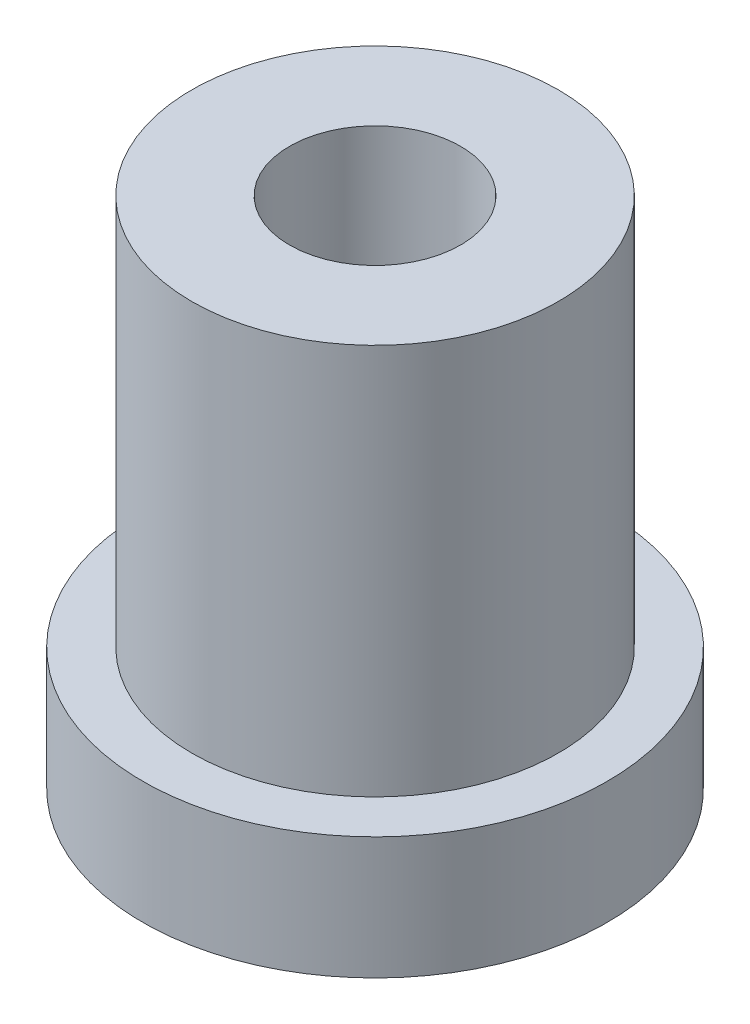
ISO-10303-21;
HEADER;
FILE_DESCRIPTION(('STEP AP214'),'2;1');
FILE_NAME('part.step','',(''),(''),'','','');
FILE_SCHEMA(('AUTOMOTIVE_DESIGN { 1 0 10303 214 1 1 1 1 }'));
ENDSEC;
DATA;
#1=APPLICATION_CONTEXT('core data for automotive mechanical design processes');
#2=APPLICATION_PROTOCOL_DEFINITION('international standard','automotive_design',2000,#1);
#3=PRODUCT_CONTEXT('',#1,'mechanical');
#4=PRODUCT('Part','Part','',(#3));
#5=PRODUCT_RELATED_PRODUCT_CATEGORY('part','',(#4));
#6=PRODUCT_DEFINITION_FORMATION('','',#4);
#7=PRODUCT_DEFINITION_CONTEXT('part definition',#1,'design');
#8=PRODUCT_DEFINITION('design','',#6,#7);
#9=PRODUCT_DEFINITION_SHAPE('','',#8);
#10=(LENGTH_UNIT() NAMED_UNIT(*) SI_UNIT(.MILLI.,.METRE.));
#11=(NAMED_UNIT(*) PLANE_ANGLE_UNIT() SI_UNIT($,.RADIAN.));
#12=(NAMED_UNIT(*) SI_UNIT($,.STERADIAN.) SOLID_ANGLE_UNIT());
#13=UNCERTAINTY_MEASURE_WITH_UNIT(LENGTH_MEASURE(1.E-05),#10,'distance_accuracy_value','');
#14=(GEOMETRIC_REPRESENTATION_CONTEXT(3) GLOBAL_UNCERTAINTY_ASSIGNED_CONTEXT((#13)) GLOBAL_UNIT_ASSIGNED_CONTEXT((#10,
#11,#12)) REPRESENTATION_CONTEXT('',''));
#15=CARTESIAN_POINT('',(0.,0.,0.));
#16=DIRECTION('',(0.,0.,1.));
#17=DIRECTION('',(1.,0.,0.));
#18=AXIS2_PLACEMENT_3D('',#15,#16,#17);
#19=CARTESIAN_POINT('',(0.,10.5,0.));
#20=DIRECTION('',(0.,-1.,0.));
#21=DIRECTION('',(0.,0.,-1.));
#22=AXIS2_PLACEMENT_3D('',#19,#20,#21);
#23=CYLINDRICAL_SURFACE('',#22,3.75);
#24=CARTESIAN_POINT('',(0.,10.5,0.));
#25=DIRECTION('',(0.,1.,0.));
#26=DIRECTION('',(0.,0.,1.));
#27=AXIS2_PLACEMENT_3D('',#24,#25,#26);
#28=CIRCLE('',#27,3.75);
#29=CARTESIAN_POINT('',(0.,10.5,-3.75));
#30=VERTEX_POINT('',#29);
#31=EDGE_CURVE('E50',#30,#30,#28,.T.);
#32=CARTESIAN_POINT('',(0.,2.5,0.));
#33=DIRECTION('',(0.,-1.,0.));
#34=DIRECTION('',(0.,0.,-1.));
#35=AXIS2_PLACEMENT_3D('',#32,#33,#34);
#36=CIRCLE('',#35,3.75);
#37=CARTESIAN_POINT('',(0.,2.5,-3.75));
#38=VERTEX_POINT('',#37);
#39=EDGE_CURVE('E10',#38,#38,#36,.T.);
#40=CARTESIAN_POINT('',(0.,10.5,-3.75));
#41=CARTESIAN_POINT('',(0.,10.4166666666667,-3.75));
#42=CARTESIAN_POINT('',(0.,10.3333333333333,-3.75));
#43=CARTESIAN_POINT('',(0.,10.1666666666667,-3.75));
#44=CARTESIAN_POINT('',(0.,10.0833333333333,-3.75));
#45=CARTESIAN_POINT('',(0.,9.91666666666667,-3.75));
#46=CARTESIAN_POINT('',(0.,9.83333333333333,-3.75));
#47=CARTESIAN_POINT('',(0.,9.66666666666667,-3.75));
#48=CARTESIAN_POINT('',(0.,9.58333333333333,-3.75));
#49=CARTESIAN_POINT('',(0.,9.41666666666667,-3.75));
#50=CARTESIAN_POINT('',(0.,9.33333333333333,-3.75));
#51=CARTESIAN_POINT('',(0.,9.16666666666667,-3.75));
#52=CARTESIAN_POINT('',(0.,9.08333333333333,-3.75));
#53=CARTESIAN_POINT('',(0.,8.91666666666667,-3.75));
#54=CARTESIAN_POINT('',(0.,8.83333333333333,-3.75));
#55=CARTESIAN_POINT('',(0.,8.66666666666667,-3.75));
#56=CARTESIAN_POINT('',(0.,8.58333333333333,-3.75));
#57=CARTESIAN_POINT('',(0.,8.41666666666667,-3.75));
#58=CARTESIAN_POINT('',(0.,8.33333333333333,-3.75));
#59=CARTESIAN_POINT('',(0.,8.16666666666667,-3.75));
#60=CARTESIAN_POINT('',(0.,8.08333333333333,-3.75));
#61=CARTESIAN_POINT('',(0.,7.91666666666667,-3.75));
#62=CARTESIAN_POINT('',(0.,7.83333333333333,-3.75));
#63=CARTESIAN_POINT('',(0.,7.66666666666667,-3.75));
#64=CARTESIAN_POINT('',(0.,7.58333333333333,-3.75));
#65=CARTESIAN_POINT('',(0.,7.41666666666667,-3.75));
#66=CARTESIAN_POINT('',(0.,7.33333333333333,-3.75));
#67=CARTESIAN_POINT('',(0.,7.16666666666667,-3.75));
#68=CARTESIAN_POINT('',(0.,7.08333333333333,-3.75));
#69=CARTESIAN_POINT('',(0.,6.91666666666667,-3.75));
#70=CARTESIAN_POINT('',(0.,6.83333333333333,-3.75));
#71=CARTESIAN_POINT('',(0.,6.66666666666667,-3.75));
#72=CARTESIAN_POINT('',(0.,6.58333333333333,-3.75));
#73=CARTESIAN_POINT('',(0.,6.41666666666667,-3.75));
#74=CARTESIAN_POINT('',(0.,6.33333333333333,-3.75));
#75=CARTESIAN_POINT('',(0.,6.16666666666667,-3.75));
#76=CARTESIAN_POINT('',(0.,6.08333333333333,-3.75));
#77=CARTESIAN_POINT('',(0.,5.91666666666667,-3.75));
#78=CARTESIAN_POINT('',(0.,5.83333333333334,-3.75));
#79=CARTESIAN_POINT('',(0.,5.66666666666667,-3.75));
#80=CARTESIAN_POINT('',(0.,5.58333333333333,-3.75));
#81=CARTESIAN_POINT('',(0.,5.41666666666667,-3.75));
#82=CARTESIAN_POINT('',(0.,5.33333333333333,-3.75));
#83=CARTESIAN_POINT('',(0.,5.16666666666667,-3.75));
#84=CARTESIAN_POINT('',(0.,5.08333333333334,-3.75));
#85=CARTESIAN_POINT('',(0.,4.91666666666667,-3.75));
#86=CARTESIAN_POINT('',(0.,4.83333333333334,-3.75));
#87=CARTESIAN_POINT('',(0.,4.66666666666667,-3.75));
#88=CARTESIAN_POINT('',(0.,4.58333333333333,-3.75));
#89=CARTESIAN_POINT('',(0.,4.41666666666667,-3.75));
#90=CARTESIAN_POINT('',(0.,4.33333333333334,-3.75));
#91=CARTESIAN_POINT('',(0.,4.16666666666667,-3.75));
#92=CARTESIAN_POINT('',(0.,4.08333333333334,-3.75));
#93=CARTESIAN_POINT('',(0.,3.91666666666667,-3.75));
#94=CARTESIAN_POINT('',(0.,3.83333333333333,-3.75));
#95=CARTESIAN_POINT('',(0.,3.66666666666667,-3.75));
#96=CARTESIAN_POINT('',(0.,3.58333333333334,-3.75));
#97=CARTESIAN_POINT('',(0.,3.41666666666667,-3.75));
#98=CARTESIAN_POINT('',(0.,3.33333333333334,-3.75));
#99=CARTESIAN_POINT('',(0.,3.16666666666667,-3.75));
#100=CARTESIAN_POINT('',(0.,3.08333333333334,-3.75));
#101=CARTESIAN_POINT('',(0.,2.91666666666667,-3.75));
#102=CARTESIAN_POINT('',(0.,2.83333333333334,-3.75));
#103=CARTESIAN_POINT('',(0.,2.66666666666667,-3.75));
#104=CARTESIAN_POINT('',(0.,2.58333333333334,-3.75));
#105=CARTESIAN_POINT('',(0.,2.5,-3.75));
#106=B_SPLINE_CURVE_WITH_KNOTS('',3,(#40,#41,#42,#43,#44,#45,#46,#47,#48,#49,#50,#51,#52,#53,
#54,#55,#56,#57,#58,#59,#60,#61,#62,#63,#64,#65,#66,#67,#68,#69,#70,#71,#72,#73,#74,#75,#76,#77,
#78,#79,#80,#81,#82,#83,#84,#85,#86,#87,#88,#89,#90,#91,#92,#93,#94,#95,#96,#97,#98,#99,#100,
#101,#102,#103,#104,#105),.UNSPECIFIED.,.F.,.F.,(4,2,2,2,2,2,2,2,2,2,2,2,2,2,2,2,2,2,2,2,2,2,2,
2,2,2,2,2,2,2,2,2,4),(0.,0.249999999999999,0.499999999999999,0.749999999999999,
0.999999999999999,1.25,1.5,1.75,2.,2.25,2.5,2.75,3.,3.25,3.5,3.75,4.,4.25,4.5,4.75,5.,5.25,5.5,
5.75,6.,6.25,6.5,6.75,7.,7.25,7.5,7.75,8.),.UNSPECIFIED.);
#107=EDGE_CURVE('BSEAM43',#30,#38,#106,.T.);
#108=ORIENTED_EDGE('',*,*,#31,.F.);
#109=ORIENTED_EDGE('',*,*,#39,.F.);
#110=ORIENTED_EDGE('',*,*,#107,.T.);
#111=ORIENTED_EDGE('',*,*,#107,.F.);
#112=EDGE_LOOP('',(#108,#110,#109,#111));
#113=FACE_BOUND('',#112,.T.);
#114=ADVANCED_FACE('F43',(#113),#23,.T.);
#115=CARTESIAN_POINT('',(0.,10.5,0.));
#116=DIRECTION('',(0.,1.,0.));
#117=DIRECTION('',(0.,0.,1.));
#118=AXIS2_PLACEMENT_3D('',#115,#116,#117);
#119=PLANE('',#118);
#120=CARTESIAN_POINT('',(0.,10.5,0.));
#121=DIRECTION('',(0.,1.,0.));
#122=DIRECTION('',(0.,0.,1.));
#123=AXIS2_PLACEMENT_3D('',#120,#121,#122);
#124=CIRCLE('',#123,1.75);
#125=CARTESIAN_POINT('',(0.,10.5,1.75));
#126=VERTEX_POINT('',#125);
#127=EDGE_CURVE('E60',#126,#126,#124,.T.);
#128=ORIENTED_EDGE('',*,*,#127,.F.);
#129=EDGE_LOOP('',(#128));
#130=FACE_BOUND('',#129,.T.);
#131=ORIENTED_EDGE('',*,*,#31,.T.);
#132=EDGE_LOOP('',(#131));
#133=FACE_BOUND('',#132,.T.);
#134=ADVANCED_FACE('F87',(#130,#133),#119,.T.);
#135=CARTESIAN_POINT('',(0.,0.,0.));
#136=DIRECTION('',(0.,1.,0.));
#137=DIRECTION('',(0.,0.,1.));
#138=AXIS2_PLACEMENT_3D('',#135,#136,#137);
#139=PLANE('',#138);
#140=CARTESIAN_POINT('',(0.,0.,0.));
#141=DIRECTION('',(0.,1.,0.));
#142=DIRECTION('',(0.,0.,1.));
#143=AXIS2_PLACEMENT_3D('',#140,#141,#142);
#144=CIRCLE('',#143,1.75);
#145=CARTESIAN_POINT('',(0.,0.,1.75));
#146=VERTEX_POINT('',#145);
#147=EDGE_CURVE('E55',#146,#146,#144,.T.);
#148=ORIENTED_EDGE('',*,*,#147,.T.);
#149=EDGE_LOOP('',(#148));
#150=FACE_BOUND('',#149,.T.);
#151=CARTESIAN_POINT('',(0.,0.,0.));
#152=DIRECTION('',(0.,-1.,0.));
#153=DIRECTION('',(0.,0.,-1.));
#154=AXIS2_PLACEMENT_3D('',#151,#152,#153);
#155=CIRCLE('',#154,4.75);
#156=CARTESIAN_POINT('',(0.,0.,-4.75));
#157=VERTEX_POINT('',#156);
#158=EDGE_CURVE('E67',#157,#157,#155,.T.);
#159=ORIENTED_EDGE('',*,*,#158,.T.);
#160=EDGE_LOOP('',(#159));
#161=FACE_BOUND('',#160,.T.);
#162=ADVANCED_FACE('F94',(#150,#161),#139,.F.);
#163=CARTESIAN_POINT('',(0.,10.5,0.));
#164=DIRECTION('',(0.,1.,0.));
#165=DIRECTION('',(0.,0.,1.));
#166=AXIS2_PLACEMENT_3D('',#163,#164,#165);
#167=CYLINDRICAL_SURFACE('',#166,1.75);
#168=ORIENTED_EDGE('',*,*,#147,.F.);
#169=EDGE_LOOP('',(#168));
#170=FACE_BOUND('',#169,.T.);
#171=ORIENTED_EDGE('',*,*,#127,.T.);
#172=EDGE_LOOP('',(#171));
#173=FACE_BOUND('',#172,.T.);
#174=ADVANCED_FACE('F84',(#170,#173),#167,.F.);
#175=CARTESIAN_POINT('',(0.,2.5,0.));
#176=DIRECTION('',(0.,-1.,0.));
#177=DIRECTION('',(0.,0.,-1.));
#178=AXIS2_PLACEMENT_3D('',#175,#176,#177);
#179=CYLINDRICAL_SURFACE('',#178,4.75);
#180=CARTESIAN_POINT('',(0.,2.5,0.));
#181=DIRECTION('',(0.,-1.,0.));
#182=DIRECTION('',(0.,0.,-1.));
#183=AXIS2_PLACEMENT_3D('',#180,#181,#182);
#184=CIRCLE('',#183,4.75);
#185=CARTESIAN_POINT('',(0.,2.5,-4.75));
#186=VERTEX_POINT('',#185);
#187=EDGE_CURVE('E66',#186,#186,#184,.T.);
#188=ORIENTED_EDGE('',*,*,#187,.T.);
#189=EDGE_LOOP('',(#188));
#190=FACE_BOUND('',#189,.T.);
#191=ORIENTED_EDGE('',*,*,#158,.F.);
#192=EDGE_LOOP('',(#191));
#193=FACE_BOUND('',#192,.T.);
#194=ADVANCED_FACE('F75',(#190,#193),#179,.T.);
#195=CARTESIAN_POINT('',(0.,2.5,0.));
#196=DIRECTION('',(0.,-1.,0.));
#197=DIRECTION('',(0.,0.,-1.));
#198=AXIS2_PLACEMENT_3D('',#195,#196,#197);
#199=PLANE('',#198);
#200=ORIENTED_EDGE('',*,*,#39,.T.);
#201=EDGE_LOOP('',(#200));
#202=FACE_BOUND('',#201,.T.);
#203=ORIENTED_EDGE('',*,*,#187,.F.);
#204=EDGE_LOOP('',(#203));
#205=FACE_BOUND('',#204,.T.);
#206=ADVANCED_FACE('F78',(#202,#205),#199,.F.);
#207=CLOSED_SHELL('',(#114,#134,#162,#174,#194,#206));
#208=MANIFOLD_SOLID_BREP('B2',#207);
#209=ADVANCED_BREP_SHAPE_REPRESENTATION('',(#18,#208),#14);
#210=SHAPE_DEFINITION_REPRESENTATION(#9,#209);
ENDSEC;
END-ISO-10303-21;
